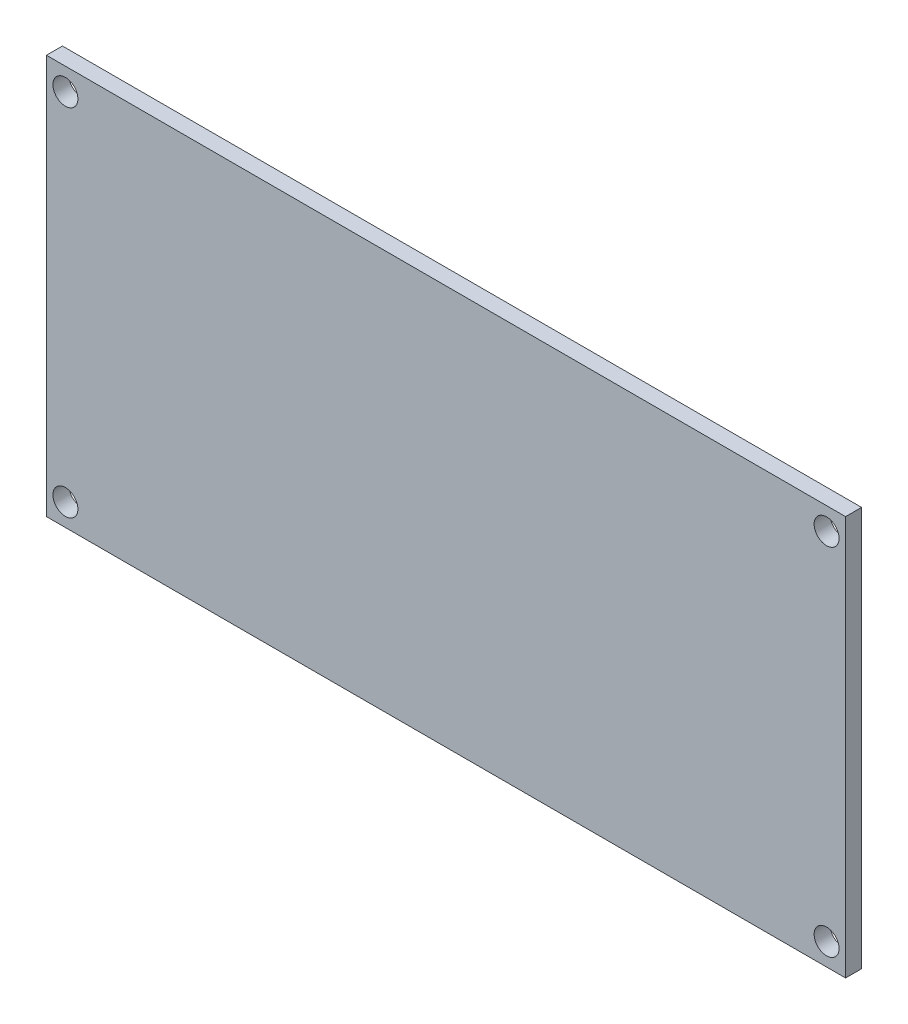
ISO-10303-21;
HEADER;
FILE_DESCRIPTION(('STEP AP214'),'2;1');
FILE_NAME('part.step','',(''),(''),'','','');
FILE_SCHEMA(('AUTOMOTIVE_DESIGN { 1 0 10303 214 1 1 1 1 }'));
ENDSEC;
DATA;
#1=APPLICATION_CONTEXT('core data for automotive mechanical design processes');
#2=APPLICATION_PROTOCOL_DEFINITION('international standard','automotive_design',2000,#1);
#3=PRODUCT_CONTEXT('',#1,'mechanical');
#4=PRODUCT('Part','Part','',(#3));
#5=PRODUCT_RELATED_PRODUCT_CATEGORY('part','',(#4));
#6=PRODUCT_DEFINITION_FORMATION('','',#4);
#7=PRODUCT_DEFINITION_CONTEXT('part definition',#1,'design');
#8=PRODUCT_DEFINITION('design','',#6,#7);
#9=PRODUCT_DEFINITION_SHAPE('','',#8);
#10=(LENGTH_UNIT() NAMED_UNIT(*) SI_UNIT(.MILLI.,.METRE.));
#11=(NAMED_UNIT(*) PLANE_ANGLE_UNIT() SI_UNIT($,.RADIAN.));
#12=(NAMED_UNIT(*) SI_UNIT($,.STERADIAN.) SOLID_ANGLE_UNIT());
#13=UNCERTAINTY_MEASURE_WITH_UNIT(LENGTH_MEASURE(1.E-05),#10,'distance_accuracy_value','');
#14=(GEOMETRIC_REPRESENTATION_CONTEXT(3) GLOBAL_UNCERTAINTY_ASSIGNED_CONTEXT((#13)) GLOBAL_UNIT_ASSIGNED_CONTEXT((#10,
#11,#12)) REPRESENTATION_CONTEXT('',''));
#15=CARTESIAN_POINT('',(0.,0.,0.));
#16=DIRECTION('',(0.,0.,1.));
#17=DIRECTION('',(1.,0.,0.));
#18=AXIS2_PLACEMENT_3D('',#15,#16,#17);
#19=CARTESIAN_POINT('',(0.,0.,1.6));
#20=DIRECTION('',(0.,0.,1.));
#21=DIRECTION('',(1.,0.,0.));
#22=AXIS2_PLACEMENT_3D('',#19,#20,#21);
#23=PLANE('',#22);
#24=CARTESIAN_POINT('',(38.1,-17.78,1.6));
#25=DIRECTION('',(0.,0.,1.));
#26=DIRECTION('',(1.,0.,0.));
#27=AXIS2_PLACEMENT_3D('',#24,#25,#26);
#28=CIRCLE('',#27,1.25);
#29=CARTESIAN_POINT('',(39.35,-17.78,1.6));
#30=VERTEX_POINT('',#29);
#31=EDGE_CURVE('E124',#30,#30,#28,.T.);
#32=ORIENTED_EDGE('',*,*,#31,.F.);
#33=EDGE_LOOP('',(#32));
#34=FACE_BOUND('',#33,.T.);
#35=CARTESIAN_POINT('',(-38.1,17.78,1.6));
#36=DIRECTION('',(0.,0.,1.));
#37=DIRECTION('',(1.,0.,0.));
#38=AXIS2_PLACEMENT_3D('',#35,#36,#37);
#39=CIRCLE('',#38,1.25);
#40=CARTESIAN_POINT('',(-36.85,17.78,1.6));
#41=VERTEX_POINT('',#40);
#42=EDGE_CURVE('E103',#41,#41,#39,.T.);
#43=ORIENTED_EDGE('',*,*,#42,.F.);
#44=EDGE_LOOP('',(#43));
#45=FACE_BOUND('',#44,.T.);
#46=DIRECTION('',(0.,-1.,0.));
#47=VECTOR('',#46,1.);
#48=CARTESIAN_POINT('',(-40.,20.,1.6));
#49=LINE('',#48,#47);
#50=CARTESIAN_POINT('',(-40.,20.,1.6));
#51=VERTEX_POINT('',#50);
#52=CARTESIAN_POINT('',(-40.,-20.,1.6));
#53=VERTEX_POINT('',#52);
#54=EDGE_CURVE('E88',#51,#53,#49,.T.);
#55=ORIENTED_EDGE('',*,*,#54,.T.);
#56=DIRECTION('',(1.,0.,0.));
#57=VECTOR('',#56,1.);
#58=CARTESIAN_POINT('',(-40.,-20.,1.6));
#59=LINE('',#58,#57);
#60=CARTESIAN_POINT('',(40.,-20.,1.6));
#61=VERTEX_POINT('',#60);
#62=EDGE_CURVE('E83',#53,#61,#59,.T.);
#63=ORIENTED_EDGE('',*,*,#62,.T.);
#64=DIRECTION('',(0.,1.,0.));
#65=VECTOR('',#64,1.);
#66=CARTESIAN_POINT('',(40.,20.,1.6));
#67=LINE('',#66,#65);
#68=CARTESIAN_POINT('',(40.,20.,1.6));
#69=VERTEX_POINT('',#68);
#70=EDGE_CURVE('E86',#61,#69,#67,.T.);
#71=ORIENTED_EDGE('',*,*,#70,.T.);
#72=DIRECTION('',(-1.,0.,0.));
#73=VECTOR('',#72,1.);
#74=CARTESIAN_POINT('',(-40.,20.,1.6));
#75=LINE('',#74,#73);
#76=EDGE_CURVE('E53',#69,#51,#75,.T.);
#77=ORIENTED_EDGE('',*,*,#76,.T.);
#78=EDGE_LOOP('',(#55,#63,#71,#77));
#79=FACE_BOUND('',#78,.T.);
#80=CARTESIAN_POINT('',(-38.1,-17.78,1.6));
#81=DIRECTION('',(0.,0.,1.));
#82=DIRECTION('',(-1.,0.,0.));
#83=AXIS2_PLACEMENT_3D('',#80,#81,#82);
#84=CIRCLE('',#83,1.25);
#85=CARTESIAN_POINT('',(-39.35,-17.78,1.6));
#86=VERTEX_POINT('',#85);
#87=EDGE_CURVE('E118',#86,#86,#84,.T.);
#88=ORIENTED_EDGE('',*,*,#87,.F.);
#89=EDGE_LOOP('',(#88));
#90=FACE_BOUND('',#89,.T.);
#91=CARTESIAN_POINT('',(38.1,17.78,1.6));
#92=DIRECTION('',(0.,0.,1.));
#93=DIRECTION('',(-1.,0.,0.));
#94=AXIS2_PLACEMENT_3D('',#91,#92,#93);
#95=CIRCLE('',#94,1.25);
#96=CARTESIAN_POINT('',(36.85,17.78,1.6));
#97=VERTEX_POINT('',#96);
#98=EDGE_CURVE('E130',#97,#97,#95,.T.);
#99=ORIENTED_EDGE('',*,*,#98,.F.);
#100=EDGE_LOOP('',(#99));
#101=FACE_BOUND('',#100,.T.);
#102=ADVANCED_FACE('F36',(#34,#45,#79,#90,#101),#23,.T.);
#103=CARTESIAN_POINT('',(0.,0.,0.));
#104=DIRECTION('',(0.,0.,1.));
#105=DIRECTION('',(1.,0.,0.));
#106=AXIS2_PLACEMENT_3D('',#103,#104,#105);
#107=PLANE('',#106);
#108=DIRECTION('',(0.,-1.,0.));
#109=VECTOR('',#108,1.);
#110=CARTESIAN_POINT('',(-40.,20.,0.));
#111=LINE('',#110,#109);
#112=CARTESIAN_POINT('',(-40.,20.,0.));
#113=VERTEX_POINT('',#112);
#114=CARTESIAN_POINT('',(-40.,-20.,0.));
#115=VERTEX_POINT('',#114);
#116=EDGE_CURVE('E100',#113,#115,#111,.T.);
#117=ORIENTED_EDGE('',*,*,#116,.F.);
#118=DIRECTION('',(-1.,0.,0.));
#119=VECTOR('',#118,1.);
#120=CARTESIAN_POINT('',(-40.,20.,0.));
#121=LINE('',#120,#119);
#122=CARTESIAN_POINT('',(40.,20.,0.));
#123=VERTEX_POINT('',#122);
#124=EDGE_CURVE('E76',#123,#113,#121,.T.);
#125=ORIENTED_EDGE('',*,*,#124,.F.);
#126=DIRECTION('',(0.,1.,0.));
#127=VECTOR('',#126,1.);
#128=CARTESIAN_POINT('',(40.,20.,0.));
#129=LINE('',#128,#127);
#130=CARTESIAN_POINT('',(40.,-20.,0.));
#131=VERTEX_POINT('',#130);
#132=EDGE_CURVE('E70',#131,#123,#129,.T.);
#133=ORIENTED_EDGE('',*,*,#132,.F.);
#134=DIRECTION('',(1.,0.,0.));
#135=VECTOR('',#134,1.);
#136=CARTESIAN_POINT('',(-40.,-20.,0.));
#137=LINE('',#136,#135);
#138=EDGE_CURVE('E92',#115,#131,#137,.T.);
#139=ORIENTED_EDGE('',*,*,#138,.F.);
#140=EDGE_LOOP('',(#117,#125,#133,#139));
#141=FACE_BOUND('',#140,.T.);
#142=CARTESIAN_POINT('',(-38.1,17.78,0.));
#143=DIRECTION('',(0.,0.,1.));
#144=DIRECTION('',(1.,0.,0.));
#145=AXIS2_PLACEMENT_3D('',#142,#143,#144);
#146=CIRCLE('',#145,1.25);
#147=CARTESIAN_POINT('',(-36.85,17.78,0.));
#148=VERTEX_POINT('',#147);
#149=EDGE_CURVE('E115',#148,#148,#146,.T.);
#150=ORIENTED_EDGE('',*,*,#149,.T.);
#151=EDGE_LOOP('',(#150));
#152=FACE_BOUND('',#151,.T.);
#153=CARTESIAN_POINT('',(-38.1,-17.78,0.));
#154=DIRECTION('',(0.,0.,1.));
#155=DIRECTION('',(-1.,0.,0.));
#156=AXIS2_PLACEMENT_3D('',#153,#154,#155);
#157=CIRCLE('',#156,1.25);
#158=CARTESIAN_POINT('',(-39.35,-17.78,0.));
#159=VERTEX_POINT('',#158);
#160=EDGE_CURVE('E121',#159,#159,#157,.T.);
#161=ORIENTED_EDGE('',*,*,#160,.T.);
#162=EDGE_LOOP('',(#161));
#163=FACE_BOUND('',#162,.T.);
#164=CARTESIAN_POINT('',(38.1,-17.78,0.));
#165=DIRECTION('',(0.,0.,1.));
#166=DIRECTION('',(1.,0.,0.));
#167=AXIS2_PLACEMENT_3D('',#164,#165,#166);
#168=CIRCLE('',#167,1.25);
#169=CARTESIAN_POINT('',(39.35,-17.78,0.));
#170=VERTEX_POINT('',#169);
#171=EDGE_CURVE('E127',#170,#170,#168,.T.);
#172=ORIENTED_EDGE('',*,*,#171,.T.);
#173=EDGE_LOOP('',(#172));
#174=FACE_BOUND('',#173,.T.);
#175=CARTESIAN_POINT('',(38.1,17.78,0.));
#176=DIRECTION('',(0.,0.,1.));
#177=DIRECTION('',(-1.,0.,0.));
#178=AXIS2_PLACEMENT_3D('',#175,#176,#177);
#179=CIRCLE('',#178,1.25);
#180=CARTESIAN_POINT('',(36.85,17.78,0.));
#181=VERTEX_POINT('',#180);
#182=EDGE_CURVE('E133',#181,#181,#179,.T.);
#183=ORIENTED_EDGE('',*,*,#182,.T.);
#184=EDGE_LOOP('',(#183));
#185=FACE_BOUND('',#184,.T.);
#186=ADVANCED_FACE('F111',(#141,#152,#163,#174,#185),#107,.F.);
#187=CARTESIAN_POINT('',(-40.,20.,1.6));
#188=DIRECTION('',(1.,0.,0.));
#189=DIRECTION('',(0.,0.,-1.));
#190=AXIS2_PLACEMENT_3D('',#187,#188,#189);
#191=PLANE('',#190);
#192=ORIENTED_EDGE('',*,*,#116,.T.);
#193=DIRECTION('',(0.,0.,-1.));
#194=VECTOR('',#193,1.);
#195=CARTESIAN_POINT('',(-40.,-20.,1.6));
#196=LINE('',#195,#194);
#197=EDGE_CURVE('E11',#53,#115,#196,.T.);
#198=ORIENTED_EDGE('',*,*,#197,.F.);
#199=ORIENTED_EDGE('',*,*,#54,.F.);
#200=DIRECTION('',(0.,0.,-1.));
#201=VECTOR('',#200,1.);
#202=CARTESIAN_POINT('',(-40.,20.,1.6));
#203=LINE('',#202,#201);
#204=EDGE_CURVE('E96',#51,#113,#203,.T.);
#205=ORIENTED_EDGE('',*,*,#204,.T.);
#206=EDGE_LOOP('',(#192,#198,#199,#205));
#207=FACE_BOUND('',#206,.T.);
#208=ADVANCED_FACE('F38',(#207),#191,.F.);
#209=CARTESIAN_POINT('',(-40.,-20.,1.6));
#210=DIRECTION('',(0.,1.,0.));
#211=DIRECTION('',(0.,0.,1.));
#212=AXIS2_PLACEMENT_3D('',#209,#210,#211);
#213=PLANE('',#212);
#214=ORIENTED_EDGE('',*,*,#138,.T.);
#215=DIRECTION('',(0.,0.,-1.));
#216=VECTOR('',#215,1.);
#217=CARTESIAN_POINT('',(40.,-20.,1.6));
#218=LINE('',#217,#216);
#219=EDGE_CURVE('E45',#61,#131,#218,.T.);
#220=ORIENTED_EDGE('',*,*,#219,.F.);
#221=ORIENTED_EDGE('',*,*,#62,.F.);
#222=ORIENTED_EDGE('',*,*,#197,.T.);
#223=EDGE_LOOP('',(#214,#220,#221,#222));
#224=FACE_BOUND('',#223,.T.);
#225=ADVANCED_FACE('F91',(#224),#213,.F.);
#226=CARTESIAN_POINT('',(40.,20.,1.6));
#227=DIRECTION('',(-1.,0.,0.));
#228=DIRECTION('',(0.,0.,1.));
#229=AXIS2_PLACEMENT_3D('',#226,#227,#228);
#230=PLANE('',#229);
#231=ORIENTED_EDGE('',*,*,#132,.T.);
#232=DIRECTION('',(0.,0.,-1.));
#233=VECTOR('',#232,1.);
#234=CARTESIAN_POINT('',(40.,20.,1.6));
#235=LINE('',#234,#233);
#236=EDGE_CURVE('E93',#69,#123,#235,.T.);
#237=ORIENTED_EDGE('',*,*,#236,.F.);
#238=ORIENTED_EDGE('',*,*,#70,.F.);
#239=ORIENTED_EDGE('',*,*,#219,.T.);
#240=EDGE_LOOP('',(#231,#237,#238,#239));
#241=FACE_BOUND('',#240,.T.);
#242=ADVANCED_FACE('F94',(#241),#230,.F.);
#243=CARTESIAN_POINT('',(-40.,20.,1.6));
#244=DIRECTION('',(0.,-1.,0.));
#245=DIRECTION('',(0.,0.,-1.));
#246=AXIS2_PLACEMENT_3D('',#243,#244,#245);
#247=PLANE('',#246);
#248=ORIENTED_EDGE('',*,*,#124,.T.);
#249=ORIENTED_EDGE('',*,*,#204,.F.);
#250=ORIENTED_EDGE('',*,*,#76,.F.);
#251=ORIENTED_EDGE('',*,*,#236,.T.);
#252=EDGE_LOOP('',(#248,#249,#250,#251));
#253=FACE_BOUND('',#252,.T.);
#254=ADVANCED_FACE('F108',(#253),#247,.F.);
#255=CARTESIAN_POINT('',(-38.1,17.78,1.6));
#256=DIRECTION('',(0.,0.,-1.));
#257=DIRECTION('',(-1.,0.,0.));
#258=AXIS2_PLACEMENT_3D('',#255,#256,#257);
#259=CYLINDRICAL_SURFACE('',#258,1.25);
#260=ORIENTED_EDGE('',*,*,#42,.T.);
#261=EDGE_LOOP('',(#260));
#262=FACE_BOUND('',#261,.T.);
#263=ORIENTED_EDGE('',*,*,#149,.F.);
#264=EDGE_LOOP('',(#263));
#265=FACE_BOUND('',#264,.T.);
#266=ADVANCED_FACE('F152',(#262,#265),#259,.F.);
#267=CARTESIAN_POINT('',(-38.1,-17.78,1.6));
#268=DIRECTION('',(0.,0.,-1.));
#269=DIRECTION('',(-1.,0.,0.));
#270=AXIS2_PLACEMENT_3D('',#267,#268,#269);
#271=CYLINDRICAL_SURFACE('',#270,1.25);
#272=ORIENTED_EDGE('',*,*,#87,.T.);
#273=EDGE_LOOP('',(#272));
#274=FACE_BOUND('',#273,.T.);
#275=ORIENTED_EDGE('',*,*,#160,.F.);
#276=EDGE_LOOP('',(#275));
#277=FACE_BOUND('',#276,.T.);
#278=ADVANCED_FACE('F202',(#274,#277),#271,.F.);
#279=CARTESIAN_POINT('',(38.1,-17.78,1.6));
#280=DIRECTION('',(0.,0.,-1.));
#281=DIRECTION('',(-1.,0.,0.));
#282=AXIS2_PLACEMENT_3D('',#279,#280,#281);
#283=CYLINDRICAL_SURFACE('',#282,1.25);
#284=ORIENTED_EDGE('',*,*,#31,.T.);
#285=EDGE_LOOP('',(#284));
#286=FACE_BOUND('',#285,.T.);
#287=ORIENTED_EDGE('',*,*,#171,.F.);
#288=EDGE_LOOP('',(#287));
#289=FACE_BOUND('',#288,.T.);
#290=ADVANCED_FACE('F210',(#286,#289),#283,.F.);
#291=CARTESIAN_POINT('',(38.1,17.78,1.6));
#292=DIRECTION('',(0.,0.,-1.));
#293=DIRECTION('',(-1.,0.,0.));
#294=AXIS2_PLACEMENT_3D('',#291,#292,#293);
#295=CYLINDRICAL_SURFACE('',#294,1.25);
#296=ORIENTED_EDGE('',*,*,#98,.T.);
#297=EDGE_LOOP('',(#296));
#298=FACE_BOUND('',#297,.T.);
#299=ORIENTED_EDGE('',*,*,#182,.F.);
#300=EDGE_LOOP('',(#299));
#301=FACE_BOUND('',#300,.T.);
#302=ADVANCED_FACE('F139',(#298,#301),#295,.F.);
#303=CLOSED_SHELL('',(#102,#186,#208,#225,#242,#254,#266,#278,#290,#302));
#304=MANIFOLD_SOLID_BREP('B2',#303);
#305=ADVANCED_BREP_SHAPE_REPRESENTATION('',(#18,#304),#14);
#306=SHAPE_DEFINITION_REPRESENTATION(#9,#305);
ENDSEC;
END-ISO-10303-21;
